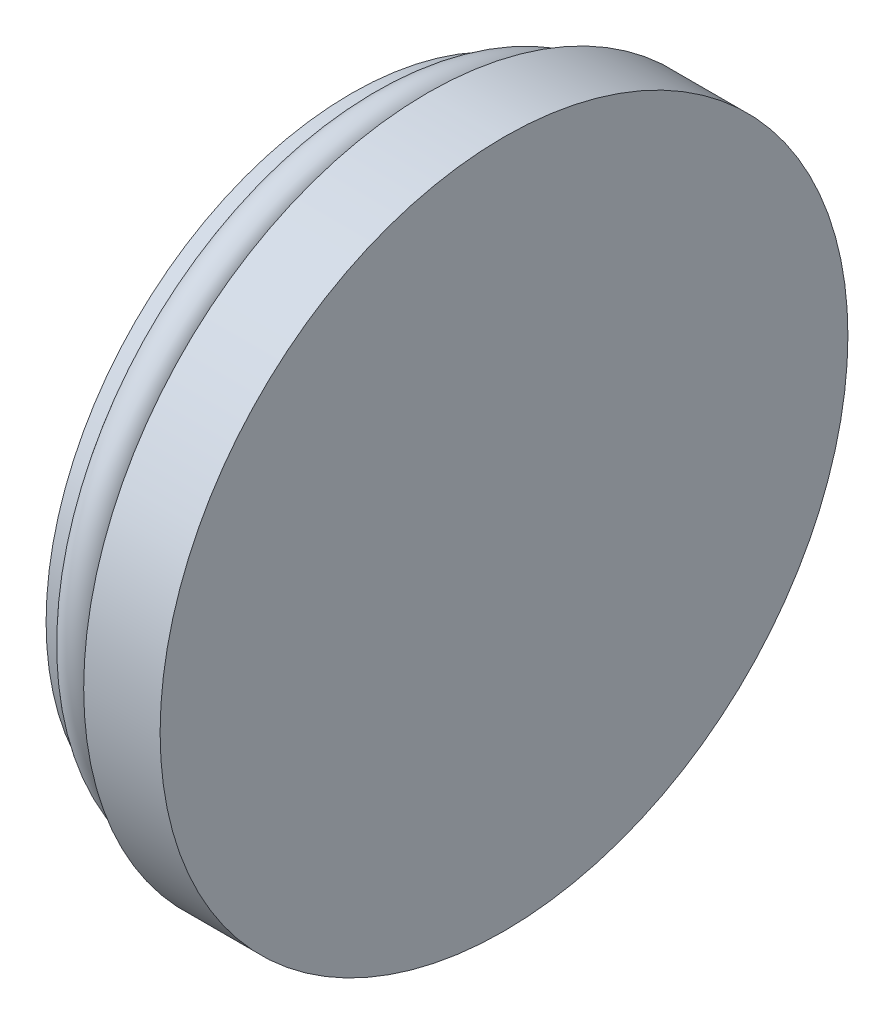
ISO-10303-21;
HEADER;
FILE_DESCRIPTION(('STEP AP214'),'2;1');
FILE_NAME('part.step','',(''),(''),'','','');
FILE_SCHEMA(('AUTOMOTIVE_DESIGN { 1 0 10303 214 1 1 1 1 }'));
ENDSEC;
DATA;
#1=APPLICATION_CONTEXT('core data for automotive mechanical design processes');
#2=APPLICATION_PROTOCOL_DEFINITION('international standard','automotive_design',2000,#1);
#3=PRODUCT_CONTEXT('',#1,'mechanical');
#4=PRODUCT('Part','Part','',(#3));
#5=PRODUCT_RELATED_PRODUCT_CATEGORY('part','',(#4));
#6=PRODUCT_DEFINITION_FORMATION('','',#4);
#7=PRODUCT_DEFINITION_CONTEXT('part definition',#1,'design');
#8=PRODUCT_DEFINITION('design','',#6,#7);
#9=PRODUCT_DEFINITION_SHAPE('','',#8);
#10=(LENGTH_UNIT() NAMED_UNIT(*) SI_UNIT(.MILLI.,.METRE.));
#11=(NAMED_UNIT(*) PLANE_ANGLE_UNIT() SI_UNIT($,.RADIAN.));
#12=(NAMED_UNIT(*) SI_UNIT($,.STERADIAN.) SOLID_ANGLE_UNIT());
#13=UNCERTAINTY_MEASURE_WITH_UNIT(LENGTH_MEASURE(1.E-05),#10,'distance_accuracy_value','');
#14=(GEOMETRIC_REPRESENTATION_CONTEXT(3) GLOBAL_UNCERTAINTY_ASSIGNED_CONTEXT((#13)) GLOBAL_UNIT_ASSIGNED_CONTEXT((#10,
#11,#12)) REPRESENTATION_CONTEXT('',''));
#15=CARTESIAN_POINT('',(0.,0.,0.));
#16=DIRECTION('',(0.,0.,1.));
#17=DIRECTION('',(1.,0.,0.));
#18=AXIS2_PLACEMENT_3D('',#15,#16,#17);
#19=CARTESIAN_POINT('',(0.,0.,0.));
#20=DIRECTION('',(1.,0.,0.));
#21=DIRECTION('',(0.,0.,-1.));
#22=AXIS2_PLACEMENT_3D('',#19,#20,#21);
#23=PLANE('',#22);
#24=CARTESIAN_POINT('',(0.,0.,0.));
#25=DIRECTION('',(1.,0.,0.));
#26=DIRECTION('',(0.,0.,-1.));
#27=AXIS2_PLACEMENT_3D('',#24,#25,#26);
#28=CIRCLE('',#27,12.6746);
#29=CARTESIAN_POINT('',(0.,0.,-12.6746));
#30=VERTEX_POINT('',#29);
#31=EDGE_CURVE('E50',#30,#30,#28,.T.);
#32=ORIENTED_EDGE('',*,*,#31,.F.);
#33=EDGE_LOOP('',(#32));
#34=FACE_BOUND('',#33,.T.);
#35=CARTESIAN_POINT('',(0.,0.,0.));
#36=DIRECTION('',(1.,0.,0.));
#37=DIRECTION('',(0.,0.,-1.));
#38=AXIS2_PLACEMENT_3D('',#35,#36,#37);
#39=CIRCLE('',#38,10.033);
#40=CARTESIAN_POINT('',(0.,0.,-10.033));
#41=VERTEX_POINT('',#40);
#42=EDGE_CURVE('E10',#41,#41,#39,.F.);
#43=ORIENTED_EDGE('',*,*,#42,.F.);
#44=EDGE_LOOP('',(#43));
#45=FACE_BOUND('',#44,.T.);
#46=ADVANCED_FACE('F36',(#34,#45),#23,.F.);
#47=CARTESIAN_POINT('',(3.175,0.,0.));
#48=DIRECTION('',(-1.,0.,0.));
#49=DIRECTION('',(0.,0.,1.));
#50=AXIS2_PLACEMENT_3D('',#47,#48,#49);
#51=CYLINDRICAL_SURFACE('',#50,12.6746);
#52=CARTESIAN_POINT('',(2.38125,0.,0.));
#53=DIRECTION('',(1.,0.,0.));
#54=DIRECTION('',(0.,0.,-1.));
#55=AXIS2_PLACEMENT_3D('',#52,#53,#54);
#56=CIRCLE('',#55,12.6746);
#57=CARTESIAN_POINT('',(2.38125,0.,-12.6746));
#58=VERTEX_POINT('',#57);
#59=EDGE_CURVE('E61',#58,#58,#56,.T.);
#60=ORIENTED_EDGE('',*,*,#59,.T.);
#61=EDGE_LOOP('',(#60));
#62=FACE_BOUND('',#61,.T.);
#63=CARTESIAN_POINT('',(3.175,0.,0.));
#64=DIRECTION('',(1.,0.,0.));
#65=DIRECTION('',(0.,0.,-1.));
#66=AXIS2_PLACEMENT_3D('',#63,#64,#65);
#67=CIRCLE('',#66,12.6746);
#68=CARTESIAN_POINT('',(3.175,0.,-12.6746));
#69=VERTEX_POINT('',#68);
#70=EDGE_CURVE('E44',#69,#69,#67,.T.);
#71=ORIENTED_EDGE('',*,*,#70,.F.);
#72=EDGE_LOOP('',(#71));
#73=FACE_BOUND('',#72,.T.);
#74=ADVANCED_FACE('F38',(#62,#73),#51,.T.);
#75=CARTESIAN_POINT('',(6.35,0.,0.));
#76=DIRECTION('',(-1.,0.,0.));
#77=DIRECTION('',(0.,0.,1.));
#78=AXIS2_PLACEMENT_3D('',#75,#76,#77);
#79=CYLINDRICAL_SURFACE('',#78,14.2875);
#80=CARTESIAN_POINT('',(6.35,0.,0.));
#81=DIRECTION('',(1.,0.,0.));
#82=DIRECTION('',(0.,0.,-1.));
#83=AXIS2_PLACEMENT_3D('',#80,#81,#82);
#84=CIRCLE('',#83,14.2875);
#85=CARTESIAN_POINT('',(6.35,0.,-14.2875));
#86=VERTEX_POINT('',#85);
#87=EDGE_CURVE('E55',#86,#86,#84,.T.);
#88=ORIENTED_EDGE('',*,*,#87,.F.);
#89=EDGE_LOOP('',(#88));
#90=FACE_BOUND('',#89,.T.);
#91=CARTESIAN_POINT('',(3.175,0.,0.));
#92=DIRECTION('',(1.,0.,0.));
#93=DIRECTION('',(0.,0.,-1.));
#94=AXIS2_PLACEMENT_3D('',#91,#92,#93);
#95=CIRCLE('',#94,14.2875);
#96=CARTESIAN_POINT('',(3.175,0.,-14.2875));
#97=VERTEX_POINT('',#96);
#98=EDGE_CURVE('E58',#97,#97,#95,.T.);
#99=ORIENTED_EDGE('',*,*,#98,.T.);
#100=EDGE_LOOP('',(#99));
#101=FACE_BOUND('',#100,.T.);
#102=ADVANCED_FACE('F104',(#90,#101),#79,.T.);
#103=CARTESIAN_POINT('',(6.35,0.,0.));
#104=DIRECTION('',(1.,0.,0.));
#105=DIRECTION('',(0.,0.,-1.));
#106=AXIS2_PLACEMENT_3D('',#103,#104,#105);
#107=PLANE('',#106);
#108=ORIENTED_EDGE('',*,*,#87,.T.);
#109=EDGE_LOOP('',(#108));
#110=FACE_BOUND('',#109,.T.);
#111=ADVANCED_FACE('F95',(#110),#107,.T.);
#112=CARTESIAN_POINT('',(3.175,0.,0.));
#113=DIRECTION('',(1.,0.,0.));
#114=DIRECTION('',(0.,0.,-1.));
#115=AXIS2_PLACEMENT_3D('',#112,#113,#114);
#116=PLANE('',#115);
#117=ORIENTED_EDGE('',*,*,#70,.T.);
#118=EDGE_LOOP('',(#117));
#119=FACE_BOUND('',#118,.T.);
#120=ORIENTED_EDGE('',*,*,#98,.F.);
#121=EDGE_LOOP('',(#120));
#122=FACE_BOUND('',#121,.T.);
#123=ADVANCED_FACE('F86',(#119,#122),#116,.F.);
#124=CARTESIAN_POINT('',(1.5875,0.,0.));
#125=DIRECTION('',(1.,0.,0.));
#126=DIRECTION('',(0.,0.,-1.));
#127=AXIS2_PLACEMENT_3D('',#124,#125,#126);
#128=TOROIDAL_SURFACE('',#127,12.7,0.79375);
#129=CARTESIAN_POINT('',(0.793749999999998,0.,0.));
#130=DIRECTION('',(1.,0.,0.));
#131=DIRECTION('',(0.,0.,-1.));
#132=AXIS2_PLACEMENT_3D('',#129,#130,#131);
#133=CIRCLE('',#132,12.7);
#134=CARTESIAN_POINT('',(0.793749999999998,0.,-12.7));
#135=VERTEX_POINT('',#134);
#136=EDGE_CURVE('E64',#135,#135,#133,.T.);
#137=ORIENTED_EDGE('',*,*,#136,.T.);
#138=EDGE_LOOP('',(#137));
#139=FACE_BOUND('',#138,.T.);
#140=CARTESIAN_POINT('',(2.38125,0.,0.));
#141=DIRECTION('',(1.,0.,0.));
#142=DIRECTION('',(0.,0.,-1.));
#143=AXIS2_PLACEMENT_3D('',#140,#141,#142);
#144=CIRCLE('',#143,12.7);
#145=CARTESIAN_POINT('',(2.38125,0.,-12.7));
#146=VERTEX_POINT('',#145);
#147=EDGE_CURVE('E77',#146,#146,#144,.T.);
#148=ORIENTED_EDGE('',*,*,#147,.F.);
#149=EDGE_LOOP('',(#148));
#150=FACE_BOUND('',#149,.T.);
#151=ADVANCED_FACE('F83',(#139,#150),#128,.T.);
#152=CARTESIAN_POINT('',(0.793749999999998,11.90625,0.));
#153=DIRECTION('',(-1.,0.,0.));
#154=DIRECTION('',(0.,0.,1.));
#155=AXIS2_PLACEMENT_3D('',#152,#153,#154);
#156=PLANE('',#155);
#157=CARTESIAN_POINT('',(0.793749999999998,0.,0.));
#158=DIRECTION('',(-1.,0.,0.));
#159=DIRECTION('',(0.,0.,1.));
#160=AXIS2_PLACEMENT_3D('',#157,#158,#159);
#161=CIRCLE('',#160,12.6746);
#162=CARTESIAN_POINT('',(0.793749999999998,0.,12.6746));
#163=VERTEX_POINT('',#162);
#164=EDGE_CURVE('E63',#163,#163,#161,.T.);
#165=ORIENTED_EDGE('',*,*,#164,.F.);
#166=EDGE_LOOP('',(#165));
#167=FACE_BOUND('',#166,.T.);
#168=ORIENTED_EDGE('',*,*,#136,.F.);
#169=EDGE_LOOP('',(#168));
#170=FACE_BOUND('',#169,.T.);
#171=ADVANCED_FACE('F85',(#167,#170),#156,.T.);
#172=CARTESIAN_POINT('',(2.38125,12.7,0.));
#173=DIRECTION('',(1.,0.,0.));
#174=DIRECTION('',(0.,0.,-1.));
#175=AXIS2_PLACEMENT_3D('',#172,#173,#174);
#176=PLANE('',#175);
#177=ORIENTED_EDGE('',*,*,#59,.F.);
#178=EDGE_LOOP('',(#177));
#179=FACE_BOUND('',#178,.T.);
#180=ORIENTED_EDGE('',*,*,#147,.T.);
#181=EDGE_LOOP('',(#180));
#182=FACE_BOUND('',#181,.T.);
#183=ADVANCED_FACE('F81',(#179,#182),#176,.T.);
#184=ORIENTED_EDGE('',*,*,#42,.T.);
#185=EDGE_LOOP('',(#184));
#186=FACE_BOUND('',#185,.T.);
#187=ADVANCED_FACE('F100',(#186),#23,.F.);
#188=ORIENTED_EDGE('',*,*,#164,.T.);
#189=EDGE_LOOP('',(#188));
#190=FACE_BOUND('',#189,.T.);
#191=ORIENTED_EDGE('',*,*,#31,.T.);
#192=EDGE_LOOP('',(#191));
#193=FACE_BOUND('',#192,.T.);
#194=ADVANCED_FACE('F106',(#190,#193),#51,.T.);
#195=CLOSED_SHELL('',(#46,#74,#102,#111,#123,#151,#171,#183,#187,#194));
#196=MANIFOLD_SOLID_BREP('B2',#195);
#197=ADVANCED_BREP_SHAPE_REPRESENTATION('',(#18,#196),#14);
#198=SHAPE_DEFINITION_REPRESENTATION(#9,#197);
ENDSEC;
END-ISO-10303-21;
